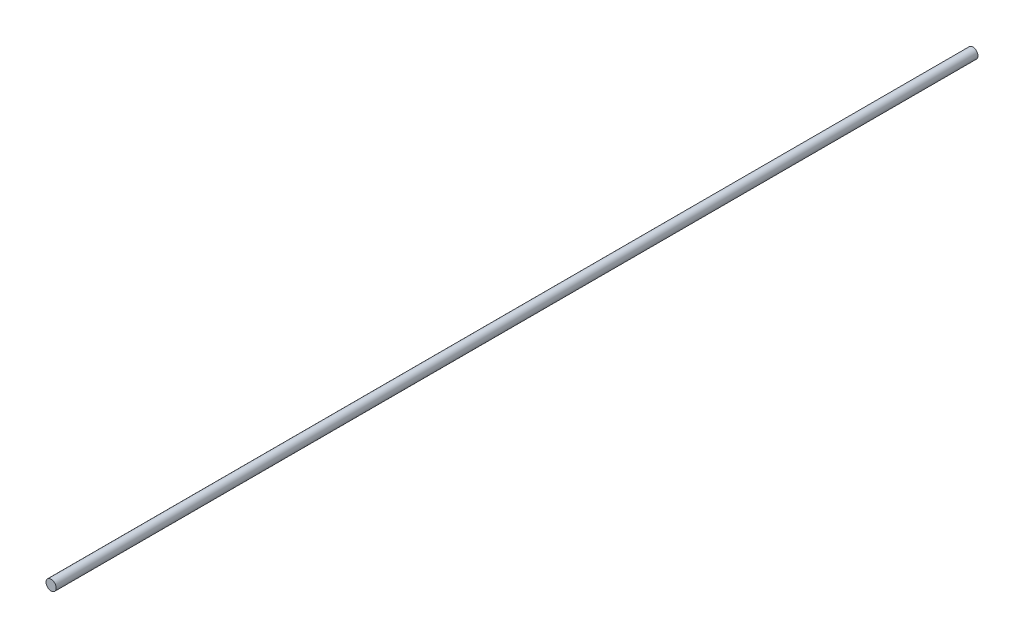
ISO-10303-21;
HEADER;
FILE_DESCRIPTION(('STEP AP214'),'2;1');
FILE_NAME('part.step','',(''),(''),'','','');
FILE_SCHEMA(('AUTOMOTIVE_DESIGN { 1 0 10303 214 1 1 1 1 }'));
ENDSEC;
DATA;
#1=APPLICATION_CONTEXT('core data for automotive mechanical design processes');
#2=APPLICATION_PROTOCOL_DEFINITION('international standard','automotive_design',2000,#1);
#3=PRODUCT_CONTEXT('',#1,'mechanical');
#4=PRODUCT('Part','Part','',(#3));
#5=PRODUCT_RELATED_PRODUCT_CATEGORY('part','',(#4));
#6=PRODUCT_DEFINITION_FORMATION('','',#4);
#7=PRODUCT_DEFINITION_CONTEXT('part definition',#1,'design');
#8=PRODUCT_DEFINITION('design','',#6,#7);
#9=PRODUCT_DEFINITION_SHAPE('','',#8);
#10=(LENGTH_UNIT() NAMED_UNIT(*) SI_UNIT(.MILLI.,.METRE.));
#11=(NAMED_UNIT(*) PLANE_ANGLE_UNIT() SI_UNIT($,.RADIAN.));
#12=(NAMED_UNIT(*) SI_UNIT($,.STERADIAN.) SOLID_ANGLE_UNIT());
#13=UNCERTAINTY_MEASURE_WITH_UNIT(LENGTH_MEASURE(1.E-05),#10,'distance_accuracy_value','');
#14=(GEOMETRIC_REPRESENTATION_CONTEXT(3) GLOBAL_UNCERTAINTY_ASSIGNED_CONTEXT((#13)) GLOBAL_UNIT_ASSIGNED_CONTEXT((#10,
#11,#12)) REPRESENTATION_CONTEXT('',''));
#15=CARTESIAN_POINT('',(0.,0.,0.));
#16=DIRECTION('',(0.,0.,1.));
#17=DIRECTION('',(1.,0.,0.));
#18=AXIS2_PLACEMENT_3D('',#15,#16,#17);
#19=CARTESIAN_POINT('',(0.,0.,721.));
#20=DIRECTION('',(0.,0.,-1.));
#21=DIRECTION('',(-1.,0.,0.));
#22=AXIS2_PLACEMENT_3D('',#19,#20,#21);
#23=CYLINDRICAL_SURFACE('',#22,4.);
#24=CARTESIAN_POINT('',(0.,0.,721.));
#25=DIRECTION('',(0.,0.,1.));
#26=DIRECTION('',(1.,0.,0.));
#27=AXIS2_PLACEMENT_3D('',#24,#25,#26);
#28=CIRCLE('',#27,4.);
#29=CARTESIAN_POINT('',(4.,0.,721.));
#30=VERTEX_POINT('',#29);
#31=EDGE_CURVE('E10',#30,#30,#28,.T.);
#32=ORIENTED_EDGE('',*,*,#31,.F.);
#33=EDGE_LOOP('',(#32));
#34=FACE_BOUND('',#33,.T.);
#35=CARTESIAN_POINT('',(0.,0.,0.));
#36=DIRECTION('',(0.,0.,1.));
#37=DIRECTION('',(1.,0.,0.));
#38=AXIS2_PLACEMENT_3D('',#35,#36,#37);
#39=CIRCLE('',#38,4.);
#40=CARTESIAN_POINT('',(4.,0.,0.));
#41=VERTEX_POINT('',#40);
#42=EDGE_CURVE('E36',#41,#41,#39,.T.);
#43=ORIENTED_EDGE('',*,*,#42,.T.);
#44=EDGE_LOOP('',(#43));
#45=FACE_BOUND('',#44,.T.);
#46=ADVANCED_FACE('F33',(#34,#45),#23,.T.);
#47=CARTESIAN_POINT('',(0.,0.,721.));
#48=DIRECTION('',(0.,0.,1.));
#49=DIRECTION('',(1.,0.,0.));
#50=AXIS2_PLACEMENT_3D('',#47,#48,#49);
#51=PLANE('',#50);
#52=ORIENTED_EDGE('',*,*,#31,.T.);
#53=EDGE_LOOP('',(#52));
#54=FACE_BOUND('',#53,.T.);
#55=ADVANCED_FACE('F48',(#54),#51,.T.);
#56=CARTESIAN_POINT('',(0.,0.,0.));
#57=DIRECTION('',(0.,0.,1.));
#58=DIRECTION('',(1.,0.,0.));
#59=AXIS2_PLACEMENT_3D('',#56,#57,#58);
#60=PLANE('',#59);
#61=ORIENTED_EDGE('',*,*,#42,.F.);
#62=EDGE_LOOP('',(#61));
#63=FACE_BOUND('',#62,.T.);
#64=ADVANCED_FACE('F46',(#63),#60,.F.);
#65=CLOSED_SHELL('',(#46,#55,#64));
#66=MANIFOLD_SOLID_BREP('B2',#65);
#67=ADVANCED_BREP_SHAPE_REPRESENTATION('',(#18,#66),#14);
#68=SHAPE_DEFINITION_REPRESENTATION(#9,#67);
ENDSEC;
END-ISO-10303-21;
